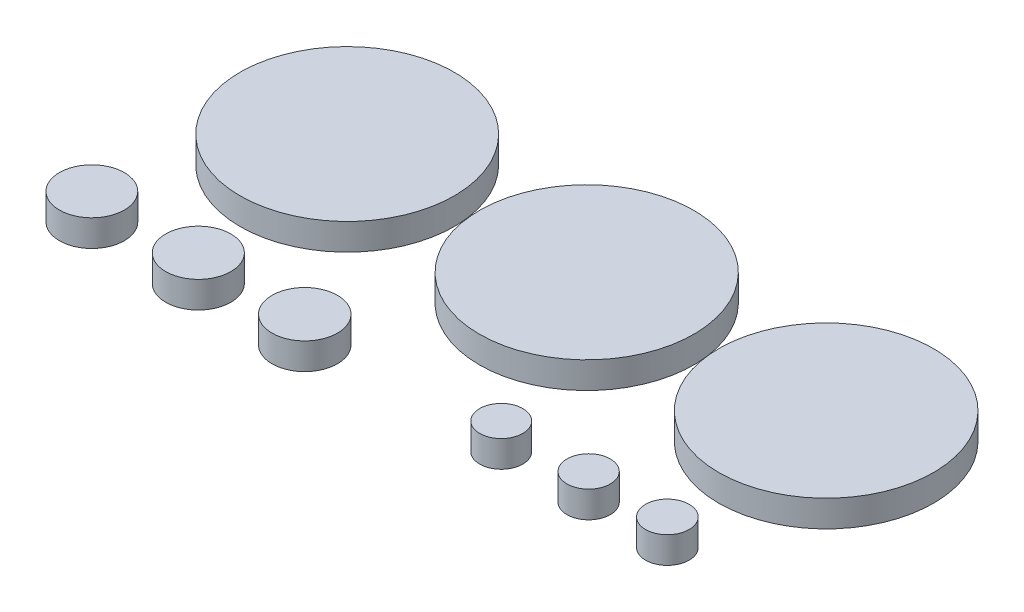
ISO-10303-21;
HEADER;
FILE_DESCRIPTION(('STEP AP214'),'2;1');
FILE_NAME('part.step','',(''),(''),'','','');
FILE_SCHEMA(('AUTOMOTIVE_DESIGN { 1 0 10303 214 1 1 1 1 }'));
ENDSEC;
DATA;
#1=APPLICATION_CONTEXT('core data for automotive mechanical design processes');
#2=APPLICATION_PROTOCOL_DEFINITION('international standard','automotive_design',2000,#1);
#3=PRODUCT_CONTEXT('',#1,'mechanical');
#4=PRODUCT('Part','Part','',(#3));
#5=PRODUCT_RELATED_PRODUCT_CATEGORY('part','',(#4));
#6=PRODUCT_DEFINITION_FORMATION('','',#4);
#7=PRODUCT_DEFINITION_CONTEXT('part definition',#1,'design');
#8=PRODUCT_DEFINITION('design','',#6,#7);
#9=PRODUCT_DEFINITION_SHAPE('','',#8);
#10=(LENGTH_UNIT() NAMED_UNIT(*) SI_UNIT(.MILLI.,.METRE.));
#11=(NAMED_UNIT(*) PLANE_ANGLE_UNIT() SI_UNIT($,.RADIAN.));
#12=(NAMED_UNIT(*) SI_UNIT($,.STERADIAN.) SOLID_ANGLE_UNIT());
#13=UNCERTAINTY_MEASURE_WITH_UNIT(LENGTH_MEASURE(1.E-05),#10,'distance_accuracy_value','');
#14=(GEOMETRIC_REPRESENTATION_CONTEXT(3) GLOBAL_UNCERTAINTY_ASSIGNED_CONTEXT((#13)) GLOBAL_UNIT_ASSIGNED_CONTEXT((#10,
#11,#12)) REPRESENTATION_CONTEXT('',''));
#15=CARTESIAN_POINT('',(0.,0.,0.));
#16=DIRECTION('',(0.,0.,1.));
#17=DIRECTION('',(1.,0.,0.));
#18=AXIS2_PLACEMENT_3D('',#15,#16,#17);
#19=CARTESIAN_POINT('',(21.9853293201917,5.,1.05488932749022));
#20=DIRECTION('',(0.,-1.,0.));
#21=DIRECTION('',(0.,0.,-1.));
#22=AXIS2_PLACEMENT_3D('',#19,#20,#21);
#23=CYLINDRICAL_SURFACE('',#22,4.05);
#24=CARTESIAN_POINT('',(21.9853293201917,5.,1.05488932749022));
#25=DIRECTION('',(0.,1.,0.));
#26=DIRECTION('',(0.,0.,1.));
#27=AXIS2_PLACEMENT_3D('',#24,#25,#26);
#28=CIRCLE('',#27,4.05);
#29=CARTESIAN_POINT('',(21.9853293201917,5.,5.10488932749022));
#30=VERTEX_POINT('',#29);
#31=EDGE_CURVE('E50',#30,#30,#28,.T.);
#32=ORIENTED_EDGE('',*,*,#31,.F.);
#33=EDGE_LOOP('',(#32));
#34=FACE_BOUND('',#33,.T.);
#35=CARTESIAN_POINT('',(21.9853293201917,0.,1.05488932749022));
#36=DIRECTION('',(0.,1.,0.));
#37=DIRECTION('',(0.,0.,1.));
#38=AXIS2_PLACEMENT_3D('',#35,#36,#37);
#39=CIRCLE('',#38,4.05);
#40=CARTESIAN_POINT('',(21.9853293201917,0.,5.10488932749022));
#41=VERTEX_POINT('',#40);
#42=EDGE_CURVE('E11',#41,#41,#39,.T.);
#43=ORIENTED_EDGE('',*,*,#42,.T.);
#44=EDGE_LOOP('',(#43));
#45=FACE_BOUND('',#44,.T.);
#46=ADVANCED_FACE('F46',(#34,#45),#23,.T.);
#47=CARTESIAN_POINT('',(21.9853293201917,5.,1.05488932749022));
#48=DIRECTION('',(0.,1.,0.));
#49=DIRECTION('',(0.,0.,1.));
#50=AXIS2_PLACEMENT_3D('',#47,#48,#49);
#51=PLANE('',#50);
#52=ORIENTED_EDGE('',*,*,#31,.T.);
#53=EDGE_LOOP('',(#52));
#54=FACE_BOUND('',#53,.T.);
#55=ADVANCED_FACE('F48',(#54),#51,.T.);
#56=CARTESIAN_POINT('',(21.9853293201917,0.,1.05488932749022));
#57=DIRECTION('',(0.,1.,0.));
#58=DIRECTION('',(0.,0.,1.));
#59=AXIS2_PLACEMENT_3D('',#56,#57,#58);
#60=PLANE('',#59);
#61=ORIENTED_EDGE('',*,*,#42,.F.);
#62=EDGE_LOOP('',(#61));
#63=FACE_BOUND('',#62,.T.);
#64=ADVANCED_FACE('F65',(#63),#60,.F.);
#65=CLOSED_SHELL('',(#46,#55,#64));
#66=MANIFOLD_SOLID_BREP('B2',#65);
#67=CARTESIAN_POINT('',(53.2030915290747,5.,1.05488932749022));
#68=DIRECTION('',(0.,-1.,0.));
#69=DIRECTION('',(0.,0.,-1.));
#70=AXIS2_PLACEMENT_3D('',#67,#68,#69);
#71=CYLINDRICAL_SURFACE('',#70,4.1);
#72=CARTESIAN_POINT('',(53.2030915290747,5.,1.05488932749022));
#73=DIRECTION('',(0.,1.,0.));
#74=DIRECTION('',(0.,0.,1.));
#75=AXIS2_PLACEMENT_3D('',#72,#73,#74);
#76=CIRCLE('',#75,4.1);
#77=CARTESIAN_POINT('',(53.2030915290747,5.,5.15488932749022));
#78=VERTEX_POINT('',#77);
#79=EDGE_CURVE('E99',#78,#78,#76,.T.);
#80=ORIENTED_EDGE('',*,*,#79,.F.);
#81=EDGE_LOOP('',(#80));
#82=FACE_BOUND('',#81,.T.);
#83=CARTESIAN_POINT('',(53.2030915290747,0.,1.05488932749022));
#84=DIRECTION('',(0.,1.,0.));
#85=DIRECTION('',(0.,0.,1.));
#86=AXIS2_PLACEMENT_3D('',#83,#84,#85);
#87=CIRCLE('',#86,4.1);
#88=CARTESIAN_POINT('',(53.2030915290747,0.,5.15488932749022));
#89=VERTEX_POINT('',#88);
#90=EDGE_CURVE('E45',#89,#89,#87,.T.);
#91=ORIENTED_EDGE('',*,*,#90,.T.);
#92=EDGE_LOOP('',(#91));
#93=FACE_BOUND('',#92,.T.);
#94=ADVANCED_FACE('F95',(#82,#93),#71,.T.);
#95=CARTESIAN_POINT('',(53.2030915290747,5.,1.05488932749022));
#96=DIRECTION('',(0.,1.,0.));
#97=DIRECTION('',(0.,0.,1.));
#98=AXIS2_PLACEMENT_3D('',#95,#96,#97);
#99=PLANE('',#98);
#100=ORIENTED_EDGE('',*,*,#79,.T.);
#101=EDGE_LOOP('',(#100));
#102=FACE_BOUND('',#101,.T.);
#103=ADVANCED_FACE('F97',(#102),#99,.T.);
#104=CARTESIAN_POINT('',(53.2030915290747,0.,1.05488932749022));
#105=DIRECTION('',(0.,1.,0.));
#106=DIRECTION('',(0.,0.,1.));
#107=AXIS2_PLACEMENT_3D('',#104,#105,#106);
#108=PLANE('',#107);
#109=ORIENTED_EDGE('',*,*,#90,.F.);
#110=EDGE_LOOP('',(#109));
#111=FACE_BOUND('',#110,.T.);
#112=ADVANCED_FACE('F114',(#111),#108,.F.);
#113=CLOSED_SHELL('',(#94,#103,#112));
#114=MANIFOLD_SOLID_BREP('B6',#113);
#115=CARTESIAN_POINT('',(38.4085868300823,5.,1.05488932749022));
#116=DIRECTION('',(0.,-1.,0.));
#117=DIRECTION('',(0.,0.,-1.));
#118=AXIS2_PLACEMENT_3D('',#115,#116,#117);
#119=CYLINDRICAL_SURFACE('',#118,4.075);
#120=CARTESIAN_POINT('',(38.4085868300823,5.,1.05488932749022));
#121=DIRECTION('',(0.,1.,0.));
#122=DIRECTION('',(0.,0.,1.));
#123=AXIS2_PLACEMENT_3D('',#120,#121,#122);
#124=CIRCLE('',#123,4.075);
#125=CARTESIAN_POINT('',(38.4085868300823,5.,5.12988932749022));
#126=VERTEX_POINT('',#125);
#127=EDGE_CURVE('E148',#126,#126,#124,.T.);
#128=ORIENTED_EDGE('',*,*,#127,.F.);
#129=EDGE_LOOP('',(#128));
#130=FACE_BOUND('',#129,.T.);
#131=CARTESIAN_POINT('',(38.4085868300823,0.,1.05488932749022));
#132=DIRECTION('',(0.,1.,0.));
#133=DIRECTION('',(0.,0.,1.));
#134=AXIS2_PLACEMENT_3D('',#131,#132,#133);
#135=CIRCLE('',#134,4.075);
#136=CARTESIAN_POINT('',(38.4085868300823,0.,5.12988932749022));
#137=VERTEX_POINT('',#136);
#138=EDGE_CURVE('E94',#137,#137,#135,.T.);
#139=ORIENTED_EDGE('',*,*,#138,.T.);
#140=EDGE_LOOP('',(#139));
#141=FACE_BOUND('',#140,.T.);
#142=ADVANCED_FACE('F144',(#130,#141),#119,.T.);
#143=CARTESIAN_POINT('',(38.4085868300823,5.,1.05488932749022));
#144=DIRECTION('',(0.,1.,0.));
#145=DIRECTION('',(0.,0.,1.));
#146=AXIS2_PLACEMENT_3D('',#143,#144,#145);
#147=PLANE('',#146);
#148=ORIENTED_EDGE('',*,*,#127,.T.);
#149=EDGE_LOOP('',(#148));
#150=FACE_BOUND('',#149,.T.);
#151=ADVANCED_FACE('F146',(#150),#147,.T.);
#152=CARTESIAN_POINT('',(38.4085868300823,0.,1.05488932749022));
#153=DIRECTION('',(0.,1.,0.));
#154=DIRECTION('',(0.,0.,1.));
#155=AXIS2_PLACEMENT_3D('',#152,#153,#154);
#156=PLANE('',#155);
#157=ORIENTED_EDGE('',*,*,#138,.F.);
#158=EDGE_LOOP('',(#157));
#159=FACE_BOUND('',#158,.T.);
#160=ADVANCED_FACE('F163',(#159),#156,.F.);
#161=CLOSED_SHELL('',(#142,#151,#160));
#162=MANIFOLD_SOLID_BREP('B40',#161);
#163=CARTESIAN_POINT('',(-13.8472325195696,5.,2.14072453475571));
#164=DIRECTION('',(0.,-1.,0.));
#165=DIRECTION('',(0.,0.,-1.));
#166=AXIS2_PLACEMENT_3D('',#163,#164,#165);
#167=CYLINDRICAL_SURFACE('',#166,6.15);
#168=CARTESIAN_POINT('',(-13.8472325195696,5.,2.14072453475571));
#169=DIRECTION('',(0.,1.,0.));
#170=DIRECTION('',(0.,0.,1.));
#171=AXIS2_PLACEMENT_3D('',#168,#169,#170);
#172=CIRCLE('',#171,6.15);
#173=CARTESIAN_POINT('',(-13.8472325195696,5.,8.29072453475571));
#174=VERTEX_POINT('',#173);
#175=EDGE_CURVE('E197',#174,#174,#172,.T.);
#176=ORIENTED_EDGE('',*,*,#175,.F.);
#177=EDGE_LOOP('',(#176));
#178=FACE_BOUND('',#177,.T.);
#179=CARTESIAN_POINT('',(-13.8472325195696,0.,2.14072453475571));
#180=DIRECTION('',(0.,1.,0.));
#181=DIRECTION('',(0.,0.,1.));
#182=AXIS2_PLACEMENT_3D('',#179,#180,#181);
#183=CIRCLE('',#182,6.15);
#184=CARTESIAN_POINT('',(-13.8472325195696,0.,8.29072453475571));
#185=VERTEX_POINT('',#184);
#186=EDGE_CURVE('E143',#185,#185,#183,.T.);
#187=ORIENTED_EDGE('',*,*,#186,.T.);
#188=EDGE_LOOP('',(#187));
#189=FACE_BOUND('',#188,.T.);
#190=ADVANCED_FACE('F193',(#178,#189),#167,.T.);
#191=CARTESIAN_POINT('',(-13.8472325195696,5.,2.14072453475571));
#192=DIRECTION('',(0.,1.,0.));
#193=DIRECTION('',(0.,0.,1.));
#194=AXIS2_PLACEMENT_3D('',#191,#192,#193);
#195=PLANE('',#194);
#196=ORIENTED_EDGE('',*,*,#175,.T.);
#197=EDGE_LOOP('',(#196));
#198=FACE_BOUND('',#197,.T.);
#199=ADVANCED_FACE('F195',(#198),#195,.T.);
#200=CARTESIAN_POINT('',(-13.8472325195696,0.,2.14072453475571));
#201=DIRECTION('',(0.,1.,0.));
#202=DIRECTION('',(0.,0.,1.));
#203=AXIS2_PLACEMENT_3D('',#200,#201,#202);
#204=PLANE('',#203);
#205=ORIENTED_EDGE('',*,*,#186,.F.);
#206=EDGE_LOOP('',(#205));
#207=FACE_BOUND('',#206,.T.);
#208=ADVANCED_FACE('F212',(#207),#204,.F.);
#209=CLOSED_SHELL('',(#190,#199,#208));
#210=MANIFOLD_SOLID_BREP('B89',#209);
#211=CARTESIAN_POINT('',(-33.8472325195696,5.,2.14072453475571));
#212=DIRECTION('',(0.,-1.,0.));
#213=DIRECTION('',(0.,0.,-1.));
#214=AXIS2_PLACEMENT_3D('',#211,#212,#213);
#215=CYLINDRICAL_SURFACE('',#214,6.125);
#216=CARTESIAN_POINT('',(-33.8472325195696,5.,2.14072453475571));
#217=DIRECTION('',(0.,1.,0.));
#218=DIRECTION('',(0.,0.,1.));
#219=AXIS2_PLACEMENT_3D('',#216,#217,#218);
#220=CIRCLE('',#219,6.125);
#221=CARTESIAN_POINT('',(-33.8472325195696,5.,8.26572453475571));
#222=VERTEX_POINT('',#221);
#223=EDGE_CURVE('E246',#222,#222,#220,.T.);
#224=ORIENTED_EDGE('',*,*,#223,.F.);
#225=EDGE_LOOP('',(#224));
#226=FACE_BOUND('',#225,.T.);
#227=CARTESIAN_POINT('',(-33.8472325195696,0.,2.14072453475571));
#228=DIRECTION('',(0.,1.,0.));
#229=DIRECTION('',(0.,0.,1.));
#230=AXIS2_PLACEMENT_3D('',#227,#228,#229);
#231=CIRCLE('',#230,6.125);
#232=CARTESIAN_POINT('',(-33.8472325195696,0.,8.26572453475571));
#233=VERTEX_POINT('',#232);
#234=EDGE_CURVE('E192',#233,#233,#231,.T.);
#235=ORIENTED_EDGE('',*,*,#234,.T.);
#236=EDGE_LOOP('',(#235));
#237=FACE_BOUND('',#236,.T.);
#238=ADVANCED_FACE('F242',(#226,#237),#215,.T.);
#239=CARTESIAN_POINT('',(-33.8472325195696,5.,2.14072453475571));
#240=DIRECTION('',(0.,1.,0.));
#241=DIRECTION('',(0.,0.,1.));
#242=AXIS2_PLACEMENT_3D('',#239,#240,#241);
#243=PLANE('',#242);
#244=ORIENTED_EDGE('',*,*,#223,.T.);
#245=EDGE_LOOP('',(#244));
#246=FACE_BOUND('',#245,.T.);
#247=ADVANCED_FACE('F244',(#246),#243,.T.);
#248=CARTESIAN_POINT('',(-33.8472325195696,0.,2.14072453475571));
#249=DIRECTION('',(0.,1.,0.));
#250=DIRECTION('',(0.,0.,1.));
#251=AXIS2_PLACEMENT_3D('',#248,#249,#250);
#252=PLANE('',#251);
#253=ORIENTED_EDGE('',*,*,#234,.F.);
#254=EDGE_LOOP('',(#253));
#255=FACE_BOUND('',#254,.T.);
#256=ADVANCED_FACE('F261',(#255),#252,.F.);
#257=CLOSED_SHELL('',(#238,#247,#256));
#258=MANIFOLD_SOLID_BREP('B138',#257);
#259=CARTESIAN_POINT('',(-53.8472325195696,5.,2.14072453475571));
#260=DIRECTION('',(0.,-1.,0.));
#261=DIRECTION('',(0.,0.,-1.));
#262=AXIS2_PLACEMENT_3D('',#259,#260,#261);
#263=CYLINDRICAL_SURFACE('',#262,6.1);
#264=CARTESIAN_POINT('',(-53.8472325195696,5.,2.14072453475571));
#265=DIRECTION('',(0.,1.,0.));
#266=DIRECTION('',(0.,0.,1.));
#267=AXIS2_PLACEMENT_3D('',#264,#265,#266);
#268=CIRCLE('',#267,6.1);
#269=CARTESIAN_POINT('',(-53.8472325195696,5.,8.24072453475571));
#270=VERTEX_POINT('',#269);
#271=EDGE_CURVE('E295',#270,#270,#268,.T.);
#272=ORIENTED_EDGE('',*,*,#271,.F.);
#273=EDGE_LOOP('',(#272));
#274=FACE_BOUND('',#273,.T.);
#275=CARTESIAN_POINT('',(-53.8472325195696,0.,2.14072453475571));
#276=DIRECTION('',(0.,1.,0.));
#277=DIRECTION('',(0.,0.,1.));
#278=AXIS2_PLACEMENT_3D('',#275,#276,#277);
#279=CIRCLE('',#278,6.1);
#280=CARTESIAN_POINT('',(-53.8472325195696,0.,8.24072453475571));
#281=VERTEX_POINT('',#280);
#282=EDGE_CURVE('E241',#281,#281,#279,.T.);
#283=ORIENTED_EDGE('',*,*,#282,.T.);
#284=EDGE_LOOP('',(#283));
#285=FACE_BOUND('',#284,.T.);
#286=ADVANCED_FACE('F291',(#274,#285),#263,.T.);
#287=CARTESIAN_POINT('',(-53.8472325195696,5.,2.14072453475571));
#288=DIRECTION('',(0.,1.,0.));
#289=DIRECTION('',(0.,0.,1.));
#290=AXIS2_PLACEMENT_3D('',#287,#288,#289);
#291=PLANE('',#290);
#292=ORIENTED_EDGE('',*,*,#271,.T.);
#293=EDGE_LOOP('',(#292));
#294=FACE_BOUND('',#293,.T.);
#295=ADVANCED_FACE('F293',(#294),#291,.T.);
#296=CARTESIAN_POINT('',(-53.8472325195696,0.,2.14072453475571));
#297=DIRECTION('',(0.,1.,0.));
#298=DIRECTION('',(0.,0.,1.));
#299=AXIS2_PLACEMENT_3D('',#296,#297,#298);
#300=PLANE('',#299);
#301=ORIENTED_EDGE('',*,*,#282,.F.);
#302=EDGE_LOOP('',(#301));
#303=FACE_BOUND('',#302,.T.);
#304=ADVANCED_FACE('F310',(#303),#300,.F.);
#305=CLOSED_SHELL('',(#286,#295,#304));
#306=MANIFOLD_SOLID_BREP('B187',#305);
#307=CARTESIAN_POINT('',(50.8192659373505,5.,-31.1664930043802));
#308=DIRECTION('',(0.,-1.,0.));
#309=DIRECTION('',(0.,0.,-1.));
#310=AXIS2_PLACEMENT_3D('',#307,#308,#309);
#311=CYLINDRICAL_SURFACE('',#310,20.175);
#312=CARTESIAN_POINT('',(50.8192659373505,5.,-31.1664930043802));
#313=DIRECTION('',(0.,1.,0.));
#314=DIRECTION('',(0.,0.,1.));
#315=AXIS2_PLACEMENT_3D('',#312,#313,#314);
#316=CIRCLE('',#315,20.175);
#317=CARTESIAN_POINT('',(50.8192659373505,5.,-10.9914930043803));
#318=VERTEX_POINT('',#317);
#319=EDGE_CURVE('E344',#318,#318,#316,.T.);
#320=ORIENTED_EDGE('',*,*,#319,.F.);
#321=EDGE_LOOP('',(#320));
#322=FACE_BOUND('',#321,.T.);
#323=CARTESIAN_POINT('',(50.8192659373505,0.,-31.1664930043802));
#324=DIRECTION('',(0.,1.,0.));
#325=DIRECTION('',(0.,0.,1.));
#326=AXIS2_PLACEMENT_3D('',#323,#324,#325);
#327=CIRCLE('',#326,20.175);
#328=CARTESIAN_POINT('',(50.8192659373505,0.,-10.9914930043803));
#329=VERTEX_POINT('',#328);
#330=EDGE_CURVE('E290',#329,#329,#327,.T.);
#331=ORIENTED_EDGE('',*,*,#330,.T.);
#332=EDGE_LOOP('',(#331));
#333=FACE_BOUND('',#332,.T.);
#334=ADVANCED_FACE('F340',(#322,#333),#311,.T.);
#335=CARTESIAN_POINT('',(50.8192659373505,5.,-31.1664930043802));
#336=DIRECTION('',(0.,1.,0.));
#337=DIRECTION('',(0.,0.,1.));
#338=AXIS2_PLACEMENT_3D('',#335,#336,#337);
#339=PLANE('',#338);
#340=ORIENTED_EDGE('',*,*,#319,.T.);
#341=EDGE_LOOP('',(#340));
#342=FACE_BOUND('',#341,.T.);
#343=ADVANCED_FACE('F342',(#342),#339,.T.);
#344=CARTESIAN_POINT('',(50.8192659373505,0.,-31.1664930043802));
#345=DIRECTION('',(0.,1.,0.));
#346=DIRECTION('',(0.,0.,1.));
#347=AXIS2_PLACEMENT_3D('',#344,#345,#346);
#348=PLANE('',#347);
#349=ORIENTED_EDGE('',*,*,#330,.F.);
#350=EDGE_LOOP('',(#349));
#351=FACE_BOUND('',#350,.T.);
#352=ADVANCED_FACE('F359',(#351),#348,.F.);
#353=CLOSED_SHELL('',(#334,#343,#352));
#354=MANIFOLD_SOLID_BREP('B236',#353);
#355=CARTESIAN_POINT('',(5.81926593735055,5.,-31.1664930043802));
#356=DIRECTION('',(0.,-1.,0.));
#357=DIRECTION('',(0.,0.,-1.));
#358=AXIS2_PLACEMENT_3D('',#355,#356,#357);
#359=CYLINDRICAL_SURFACE('',#358,20.15);
#360=CARTESIAN_POINT('',(5.81926593735055,5.,-31.1664930043802));
#361=DIRECTION('',(0.,1.,0.));
#362=DIRECTION('',(0.,0.,1.));
#363=AXIS2_PLACEMENT_3D('',#360,#361,#362);
#364=CIRCLE('',#363,20.15);
#365=CARTESIAN_POINT('',(5.81926593735055,5.,-11.0164930043802));
#366=VERTEX_POINT('',#365);
#367=EDGE_CURVE('E392',#366,#366,#364,.T.);
#368=ORIENTED_EDGE('',*,*,#367,.F.);
#369=EDGE_LOOP('',(#368));
#370=FACE_BOUND('',#369,.T.);
#371=CARTESIAN_POINT('',(5.81926593735055,0.,-31.1664930043802));
#372=DIRECTION('',(0.,1.,0.));
#373=DIRECTION('',(0.,0.,1.));
#374=AXIS2_PLACEMENT_3D('',#371,#372,#373);
#375=CIRCLE('',#374,20.15);
#376=CARTESIAN_POINT('',(5.81926593735055,0.,-11.0164930043802));
#377=VERTEX_POINT('',#376);
#378=EDGE_CURVE('E339',#377,#377,#375,.T.);
#379=ORIENTED_EDGE('',*,*,#378,.T.);
#380=EDGE_LOOP('',(#379));
#381=FACE_BOUND('',#380,.T.);
#382=ADVANCED_FACE('F388',(#370,#381),#359,.T.);
#383=CARTESIAN_POINT('',(5.81926593735055,5.,-31.1664930043802));
#384=DIRECTION('',(0.,1.,0.));
#385=DIRECTION('',(0.,0.,1.));
#386=AXIS2_PLACEMENT_3D('',#383,#384,#385);
#387=PLANE('',#386);
#388=ORIENTED_EDGE('',*,*,#367,.T.);
#389=EDGE_LOOP('',(#388));
#390=FACE_BOUND('',#389,.T.);
#391=ADVANCED_FACE('F390',(#390),#387,.T.);
#392=CARTESIAN_POINT('',(5.81926593735055,0.,-31.1664930043802));
#393=DIRECTION('',(0.,1.,0.));
#394=DIRECTION('',(0.,0.,1.));
#395=AXIS2_PLACEMENT_3D('',#392,#393,#394);
#396=PLANE('',#395);
#397=ORIENTED_EDGE('',*,*,#378,.F.);
#398=EDGE_LOOP('',(#397));
#399=FACE_BOUND('',#398,.T.);
#400=ADVANCED_FACE('F407',(#399),#396,.F.);
#401=CLOSED_SHELL('',(#382,#391,#400));
#402=MANIFOLD_SOLID_BREP('B285',#401);
#403=CARTESIAN_POINT('',(-39.1807340626494,5.,-31.1664930043802));
#404=DIRECTION('',(0.,-1.,0.));
#405=DIRECTION('',(0.,0.,-1.));
#406=AXIS2_PLACEMENT_3D('',#403,#404,#405);
#407=CYLINDRICAL_SURFACE('',#406,20.125);
#408=CARTESIAN_POINT('',(-39.1807340626494,5.,-31.1664930043802));
#409=DIRECTION('',(0.,1.,0.));
#410=DIRECTION('',(0.,0.,1.));
#411=AXIS2_PLACEMENT_3D('',#408,#409,#410);
#412=CIRCLE('',#411,20.125);
#413=CARTESIAN_POINT('',(-39.1807340626494,5.,-11.0414930043802));
#414=VERTEX_POINT('',#413);
#415=EDGE_CURVE('E387',#414,#414,#412,.T.);
#416=ORIENTED_EDGE('',*,*,#415,.F.);
#417=EDGE_LOOP('',(#416));
#418=FACE_BOUND('',#417,.T.);
#419=CARTESIAN_POINT('',(-39.1807340626494,0.,-31.1664930043802));
#420=DIRECTION('',(0.,1.,0.));
#421=DIRECTION('',(0.,0.,1.));
#422=AXIS2_PLACEMENT_3D('',#419,#420,#421);
#423=CIRCLE('',#422,20.125);
#424=CARTESIAN_POINT('',(-39.1807340626494,0.,-11.0414930043802));
#425=VERTEX_POINT('',#424);
#426=EDGE_CURVE('E432',#425,#425,#423,.T.);
#427=ORIENTED_EDGE('',*,*,#426,.T.);
#428=EDGE_LOOP('',(#427));
#429=FACE_BOUND('',#428,.T.);
#430=ADVANCED_FACE('F429',(#418,#429),#407,.T.);
#431=CARTESIAN_POINT('',(-39.1807340626494,5.,-31.1664930043802));
#432=DIRECTION('',(0.,1.,0.));
#433=DIRECTION('',(0.,0.,1.));
#434=AXIS2_PLACEMENT_3D('',#431,#432,#433);
#435=PLANE('',#434);
#436=ORIENTED_EDGE('',*,*,#415,.T.);
#437=EDGE_LOOP('',(#436));
#438=FACE_BOUND('',#437,.T.);
#439=ADVANCED_FACE('F444',(#438),#435,.T.);
#440=CARTESIAN_POINT('',(-39.1807340626494,0.,-31.1664930043802));
#441=DIRECTION('',(0.,1.,0.));
#442=DIRECTION('',(0.,0.,1.));
#443=AXIS2_PLACEMENT_3D('',#440,#441,#442);
#444=PLANE('',#443);
#445=ORIENTED_EDGE('',*,*,#426,.F.);
#446=EDGE_LOOP('',(#445));
#447=FACE_BOUND('',#446,.T.);
#448=ADVANCED_FACE('F442',(#447),#444,.F.);
#449=CLOSED_SHELL('',(#430,#439,#448));
#450=MANIFOLD_SOLID_BREP('B334',#449);
#451=ADVANCED_BREP_SHAPE_REPRESENTATION('',(#18,#66,#114,#162,#210,#258,#306,#354,#402,#450),#14);
#452=SHAPE_DEFINITION_REPRESENTATION(#9,#451);
ENDSEC;
END-ISO-10303-21;
